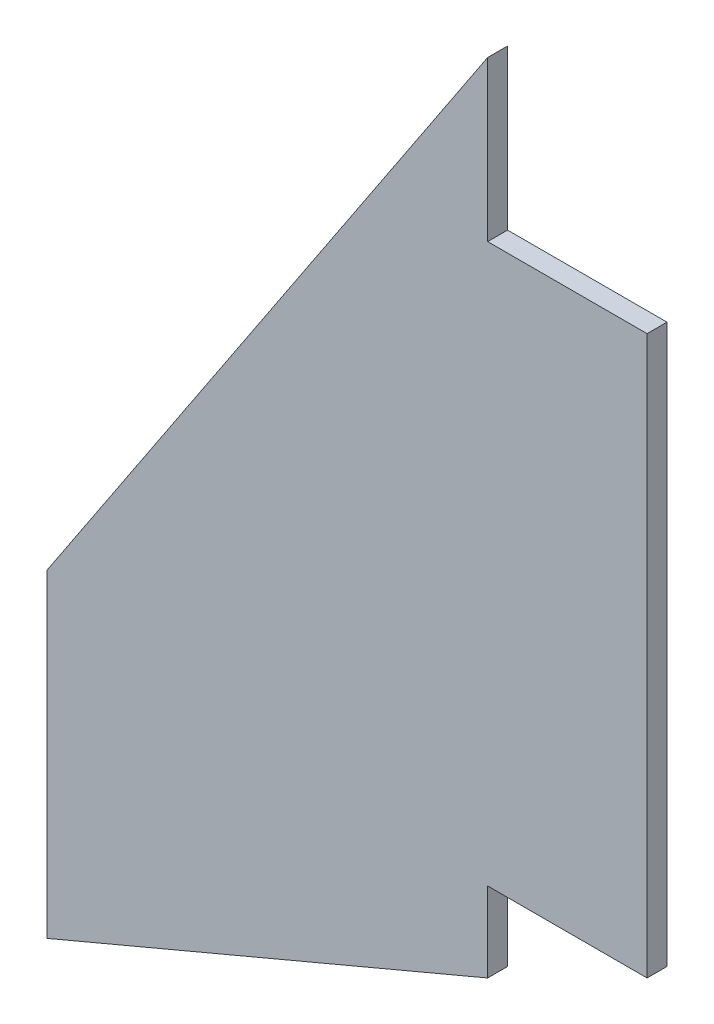
ISO-10303-21;
HEADER;
FILE_DESCRIPTION(('STEP AP214'),'2;1');
FILE_NAME('part.step','',(''),(''),'','','');
FILE_SCHEMA(('AUTOMOTIVE_DESIGN { 1 0 10303 214 1 1 1 1 }'));
ENDSEC;
DATA;
#1=APPLICATION_CONTEXT('core data for automotive mechanical design processes');
#2=APPLICATION_PROTOCOL_DEFINITION('international standard','automotive_design',2000,#1);
#3=PRODUCT_CONTEXT('',#1,'mechanical');
#4=PRODUCT('Part','Part','',(#3));
#5=PRODUCT_RELATED_PRODUCT_CATEGORY('part','',(#4));
#6=PRODUCT_DEFINITION_FORMATION('','',#4);
#7=PRODUCT_DEFINITION_CONTEXT('part definition',#1,'design');
#8=PRODUCT_DEFINITION('design','',#6,#7);
#9=PRODUCT_DEFINITION_SHAPE('','',#8);
#10=(LENGTH_UNIT() NAMED_UNIT(*) SI_UNIT(.MILLI.,.METRE.));
#11=(NAMED_UNIT(*) PLANE_ANGLE_UNIT() SI_UNIT($,.RADIAN.));
#12=(NAMED_UNIT(*) SI_UNIT($,.STERADIAN.) SOLID_ANGLE_UNIT());
#13=UNCERTAINTY_MEASURE_WITH_UNIT(LENGTH_MEASURE(1.E-05),#10,'distance_accuracy_value','');
#14=(GEOMETRIC_REPRESENTATION_CONTEXT(3) GLOBAL_UNCERTAINTY_ASSIGNED_CONTEXT((#13)) GLOBAL_UNIT_ASSIGNED_CONTEXT((#10,
#11,#12)) REPRESENTATION_CONTEXT('',''));
#15=CARTESIAN_POINT('',(0.,0.,0.));
#16=DIRECTION('',(0.,0.,1.));
#17=DIRECTION('',(1.,0.,0.));
#18=AXIS2_PLACEMENT_3D('',#15,#16,#17);
#19=CARTESIAN_POINT('',(-25.4,0.,1.5875));
#20=DIRECTION('',(0.,1.,0.));
#21=DIRECTION('',(0.,0.,1.));
#22=AXIS2_PLACEMENT_3D('',#19,#20,#21);
#23=PLANE('',#22);
#24=DIRECTION('',(1.,0.,0.));
#25=VECTOR('',#24,1.);
#26=CARTESIAN_POINT('',(-25.4,0.,-1.5875));
#27=LINE('',#26,#25);
#28=CARTESIAN_POINT('',(-25.4,0.,-1.5875));
#29=VERTEX_POINT('',#28);
#30=CARTESIAN_POINT('',(0.,0.,-1.5875));
#31=VERTEX_POINT('',#30);
#32=EDGE_CURVE('E144',#29,#31,#27,.T.);
#33=ORIENTED_EDGE('',*,*,#32,.T.);
#34=DIRECTION('',(0.,0.,-1.));
#35=VECTOR('',#34,1.);
#36=CARTESIAN_POINT('',(0.,0.,1.5875));
#37=LINE('',#36,#35);
#38=CARTESIAN_POINT('',(0.,0.,1.5875));
#39=VERTEX_POINT('',#38);
#40=EDGE_CURVE('E11',#39,#31,#37,.T.);
#41=ORIENTED_EDGE('',*,*,#40,.F.);
#42=DIRECTION('',(1.,0.,0.));
#43=VECTOR('',#42,1.);
#44=CARTESIAN_POINT('',(-25.4,0.,1.5875));
#45=LINE('',#44,#43);
#46=CARTESIAN_POINT('',(-25.4,0.,1.5875));
#47=VERTEX_POINT('',#46);
#48=EDGE_CURVE('E166',#47,#39,#45,.T.);
#49=ORIENTED_EDGE('',*,*,#48,.F.);
#50=DIRECTION('',(0.,0.,-1.));
#51=VECTOR('',#50,1.);
#52=CARTESIAN_POINT('',(-25.4,0.,1.5875));
#53=LINE('',#52,#51);
#54=EDGE_CURVE('E140',#47,#29,#53,.T.);
#55=ORIENTED_EDGE('',*,*,#54,.T.);
#56=EDGE_LOOP('',(#33,#41,#49,#55));
#57=FACE_BOUND('',#56,.T.);
#58=ADVANCED_FACE('F43',(#57),#23,.F.);
#59=CARTESIAN_POINT('',(0.,0.,1.5875));
#60=DIRECTION('',(-1.,0.,0.));
#61=DIRECTION('',(0.,0.,1.));
#62=AXIS2_PLACEMENT_3D('',#59,#60,#61);
#63=PLANE('',#62);
#64=DIRECTION('',(0.,1.,0.));
#65=VECTOR('',#64,1.);
#66=CARTESIAN_POINT('',(0.,0.,-1.5875));
#67=LINE('',#66,#65);
#68=CARTESIAN_POINT('',(0.,88.9,-1.5875));
#69=VERTEX_POINT('',#68);
#70=EDGE_CURVE('E148',#31,#69,#67,.T.);
#71=ORIENTED_EDGE('',*,*,#70,.T.);
#72=DIRECTION('',(0.,0.,-1.));
#73=VECTOR('',#72,1.);
#74=CARTESIAN_POINT('',(0.,88.9,1.5875));
#75=LINE('',#74,#73);
#76=CARTESIAN_POINT('',(0.,88.9,1.5875));
#77=VERTEX_POINT('',#76);
#78=EDGE_CURVE('E52',#77,#69,#75,.T.);
#79=ORIENTED_EDGE('',*,*,#78,.F.);
#80=DIRECTION('',(0.,1.,0.));
#81=VECTOR('',#80,1.);
#82=CARTESIAN_POINT('',(0.,0.,1.5875));
#83=LINE('',#82,#81);
#84=EDGE_CURVE('E103',#39,#77,#83,.T.);
#85=ORIENTED_EDGE('',*,*,#84,.F.);
#86=ORIENTED_EDGE('',*,*,#40,.T.);
#87=EDGE_LOOP('',(#71,#79,#85,#86));
#88=FACE_BOUND('',#87,.T.);
#89=ADVANCED_FACE('F212',(#88),#63,.F.);
#90=CARTESIAN_POINT('',(0.,88.9,1.5875));
#91=DIRECTION('',(0.,-1.,0.));
#92=DIRECTION('',(0.,0.,-1.));
#93=AXIS2_PLACEMENT_3D('',#90,#91,#92);
#94=PLANE('',#93);
#95=DIRECTION('',(-1.,0.,0.));
#96=VECTOR('',#95,1.);
#97=CARTESIAN_POINT('',(0.,88.9,-1.5875));
#98=LINE('',#97,#96);
#99=CARTESIAN_POINT('',(-25.4,88.9,-1.5875));
#100=VERTEX_POINT('',#99);
#101=EDGE_CURVE('E151',#69,#100,#98,.T.);
#102=ORIENTED_EDGE('',*,*,#101,.T.);
#103=DIRECTION('',(0.,0.,-1.));
#104=VECTOR('',#103,1.);
#105=CARTESIAN_POINT('',(-25.4,88.9,1.5875));
#106=LINE('',#105,#104);
#107=CARTESIAN_POINT('',(-25.4,88.9,1.5875));
#108=VERTEX_POINT('',#107);
#109=EDGE_CURVE('E177',#108,#100,#106,.T.);
#110=ORIENTED_EDGE('',*,*,#109,.F.);
#111=DIRECTION('',(-1.,0.,0.));
#112=VECTOR('',#111,1.);
#113=CARTESIAN_POINT('',(0.,88.9,1.5875));
#114=LINE('',#113,#112);
#115=EDGE_CURVE('E187',#77,#108,#114,.T.);
#116=ORIENTED_EDGE('',*,*,#115,.F.);
#117=ORIENTED_EDGE('',*,*,#78,.T.);
#118=EDGE_LOOP('',(#102,#110,#116,#117));
#119=FACE_BOUND('',#118,.T.);
#120=ADVANCED_FACE('F185',(#119),#94,.F.);
#121=CARTESIAN_POINT('',(-25.4,88.9,1.5875));
#122=DIRECTION('',(-1.,0.,0.));
#123=DIRECTION('',(0.,0.,1.));
#124=AXIS2_PLACEMENT_3D('',#121,#122,#123);
#125=PLANE('',#124);
#126=DIRECTION('',(0.,1.,0.));
#127=VECTOR('',#126,1.);
#128=CARTESIAN_POINT('',(-25.4,88.9,-1.5875));
#129=LINE('',#128,#127);
#130=CARTESIAN_POINT('',(-25.4,114.3,-1.5875));
#131=VERTEX_POINT('',#130);
#132=EDGE_CURVE('E154',#100,#131,#129,.T.);
#133=ORIENTED_EDGE('',*,*,#132,.T.);
#134=DIRECTION('',(0.,0.,-1.));
#135=VECTOR('',#134,1.);
#136=CARTESIAN_POINT('',(-25.4,114.3,1.5875));
#137=LINE('',#136,#135);
#138=CARTESIAN_POINT('',(-25.4,114.3,1.5875));
#139=VERTEX_POINT('',#138);
#140=EDGE_CURVE('E173',#139,#131,#137,.T.);
#141=ORIENTED_EDGE('',*,*,#140,.F.);
#142=DIRECTION('',(0.,1.,0.));
#143=VECTOR('',#142,1.);
#144=CARTESIAN_POINT('',(-25.4,88.9,1.5875));
#145=LINE('',#144,#143);
#146=EDGE_CURVE('E200',#108,#139,#145,.T.);
#147=ORIENTED_EDGE('',*,*,#146,.F.);
#148=ORIENTED_EDGE('',*,*,#109,.T.);
#149=EDGE_LOOP('',(#133,#141,#147,#148));
#150=FACE_BOUND('',#149,.T.);
#151=ADVANCED_FACE('F195',(#150),#125,.F.);
#152=CARTESIAN_POINT('',(-25.4,114.3,1.5875));
#153=DIRECTION('',(0.833333333333333,-0.552770798392566,0.));
#154=DIRECTION('',(0.552770798392566,0.833333333333334,0.));
#155=AXIS2_PLACEMENT_3D('',#152,#153,#154);
#156=PLANE('',#155);
#157=DIRECTION('',(-0.552770798392566,-0.833333333333333,0.));
#158=VECTOR('',#157,1.);
#159=CARTESIAN_POINT('',(-25.4,114.3,-1.5875));
#160=LINE('',#159,#158);
#161=CARTESIAN_POINT('',(-95.601891395856,8.46666666666661,-1.5875));
#162=VERTEX_POINT('',#161);
#163=EDGE_CURVE('E157',#131,#162,#160,.T.);
#164=ORIENTED_EDGE('',*,*,#163,.T.);
#165=DIRECTION('',(0.,0.,-1.));
#166=VECTOR('',#165,1.);
#167=CARTESIAN_POINT('',(-95.601891395856,8.46666666666661,1.5875));
#168=LINE('',#167,#166);
#169=CARTESIAN_POINT('',(-95.601891395856,8.46666666666661,1.5875));
#170=VERTEX_POINT('',#169);
#171=EDGE_CURVE('E133',#170,#162,#168,.T.);
#172=ORIENTED_EDGE('',*,*,#171,.F.);
#173=DIRECTION('',(-0.552770798392566,-0.833333333333333,0.));
#174=VECTOR('',#173,1.);
#175=CARTESIAN_POINT('',(-25.4,114.3,1.5875));
#176=LINE('',#175,#174);
#177=EDGE_CURVE('E122',#139,#170,#176,.T.);
#178=ORIENTED_EDGE('',*,*,#177,.F.);
#179=ORIENTED_EDGE('',*,*,#140,.T.);
#180=EDGE_LOOP('',(#164,#172,#178,#179));
#181=FACE_BOUND('',#180,.T.);
#182=ADVANCED_FACE('F198',(#181),#156,.F.);
#183=CARTESIAN_POINT('',(-95.601891395856,8.46666666666661,1.5875));
#184=DIRECTION('',(1.,0.,0.));
#185=DIRECTION('',(0.,0.,-1.));
#186=AXIS2_PLACEMENT_3D('',#183,#184,#185);
#187=PLANE('',#186);
#188=DIRECTION('',(0.,-1.,0.));
#189=VECTOR('',#188,1.);
#190=CARTESIAN_POINT('',(-95.601891395856,8.46666666666661,-1.5875));
#191=LINE('',#190,#189);
#192=CARTESIAN_POINT('',(-95.601891395856,-42.3333333333334,-1.5875));
#193=VERTEX_POINT('',#192);
#194=EDGE_CURVE('E131',#162,#193,#191,.T.);
#195=ORIENTED_EDGE('',*,*,#194,.T.);
#196=DIRECTION('',(0.,0.,-1.));
#197=VECTOR('',#196,1.);
#198=CARTESIAN_POINT('',(-95.601891395856,-42.3333333333334,1.5875));
#199=LINE('',#198,#197);
#200=CARTESIAN_POINT('',(-95.601891395856,-42.3333333333334,1.5875));
#201=VERTEX_POINT('',#200);
#202=EDGE_CURVE('E128',#201,#193,#199,.T.);
#203=ORIENTED_EDGE('',*,*,#202,.F.);
#204=DIRECTION('',(0.,-1.,0.));
#205=VECTOR('',#204,1.);
#206=CARTESIAN_POINT('',(-95.601891395856,8.46666666666661,1.5875));
#207=LINE('',#206,#205);
#208=EDGE_CURVE('E116',#170,#201,#207,.T.);
#209=ORIENTED_EDGE('',*,*,#208,.F.);
#210=ORIENTED_EDGE('',*,*,#171,.T.);
#211=EDGE_LOOP('',(#195,#203,#209,#210));
#212=FACE_BOUND('',#211,.T.);
#213=ADVANCED_FACE('F129',(#212),#187,.F.);
#214=CARTESIAN_POINT('',(-95.601891395856,-42.3333333333334,1.5875));
#215=DIRECTION('',(-0.38888888888889,0.921284663987611,0.));
#216=DIRECTION('',(-0.921284663987611,-0.38888888888889,0.));
#217=AXIS2_PLACEMENT_3D('',#214,#215,#216);
#218=PLANE('',#217);
#219=DIRECTION('',(0.921284663987611,0.38888888888889,0.));
#220=VECTOR('',#219,1.);
#221=CARTESIAN_POINT('',(-95.601891395856,-42.3333333333334,-1.5875));
#222=LINE('',#221,#220);
#223=CARTESIAN_POINT('',(-25.4,-12.7,-1.5875));
#224=VERTEX_POINT('',#223);
#225=EDGE_CURVE('E89',#193,#224,#222,.T.);
#226=ORIENTED_EDGE('',*,*,#225,.T.);
#227=DIRECTION('',(0.,0.,-1.));
#228=VECTOR('',#227,1.);
#229=CARTESIAN_POINT('',(-25.4,-12.7,1.5875));
#230=LINE('',#229,#228);
#231=CARTESIAN_POINT('',(-25.4,-12.7,1.5875));
#232=VERTEX_POINT('',#231);
#233=EDGE_CURVE('E134',#232,#224,#230,.T.);
#234=ORIENTED_EDGE('',*,*,#233,.F.);
#235=DIRECTION('',(0.921284663987611,0.38888888888889,0.));
#236=VECTOR('',#235,1.);
#237=CARTESIAN_POINT('',(-95.601891395856,-42.3333333333334,1.5875));
#238=LINE('',#237,#236);
#239=EDGE_CURVE('E120',#201,#232,#238,.T.);
#240=ORIENTED_EDGE('',*,*,#239,.F.);
#241=ORIENTED_EDGE('',*,*,#202,.T.);
#242=EDGE_LOOP('',(#226,#234,#240,#241));
#243=FACE_BOUND('',#242,.T.);
#244=ADVANCED_FACE('F136',(#243),#218,.F.);
#245=CARTESIAN_POINT('',(-25.4,-12.7,1.5875));
#246=DIRECTION('',(-1.,0.,0.));
#247=DIRECTION('',(0.,0.,1.));
#248=AXIS2_PLACEMENT_3D('',#245,#246,#247);
#249=PLANE('',#248);
#250=DIRECTION('',(0.,1.,0.));
#251=VECTOR('',#250,1.);
#252=CARTESIAN_POINT('',(-25.4,-12.7,-1.5875));
#253=LINE('',#252,#251);
#254=EDGE_CURVE('E95',#224,#29,#253,.T.);
#255=ORIENTED_EDGE('',*,*,#254,.T.);
#256=ORIENTED_EDGE('',*,*,#54,.F.);
#257=DIRECTION('',(0.,1.,0.));
#258=VECTOR('',#257,1.);
#259=CARTESIAN_POINT('',(-25.4,-12.7,1.5875));
#260=LINE('',#259,#258);
#261=EDGE_CURVE('E60',#232,#47,#260,.T.);
#262=ORIENTED_EDGE('',*,*,#261,.F.);
#263=ORIENTED_EDGE('',*,*,#233,.T.);
#264=EDGE_LOOP('',(#255,#256,#262,#263));
#265=FACE_BOUND('',#264,.T.);
#266=ADVANCED_FACE('F228',(#265),#249,.F.);
#267=CARTESIAN_POINT('',(0.,0.,1.5875));
#268=DIRECTION('',(0.,0.,1.));
#269=DIRECTION('',(1.,0.,0.));
#270=AXIS2_PLACEMENT_3D('',#267,#268,#269);
#271=PLANE('',#270);
#272=ORIENTED_EDGE('',*,*,#48,.T.);
#273=ORIENTED_EDGE('',*,*,#84,.T.);
#274=ORIENTED_EDGE('',*,*,#115,.T.);
#275=ORIENTED_EDGE('',*,*,#146,.T.);
#276=ORIENTED_EDGE('',*,*,#177,.T.);
#277=ORIENTED_EDGE('',*,*,#208,.T.);
#278=ORIENTED_EDGE('',*,*,#239,.T.);
#279=ORIENTED_EDGE('',*,*,#261,.T.);
#280=EDGE_LOOP('',(#272,#273,#274,#275,#276,#277,#278,#279));
#281=FACE_BOUND('',#280,.T.);
#282=ADVANCED_FACE('F118',(#281),#271,.T.);
#283=CARTESIAN_POINT('',(0.,0.,-1.5875));
#284=DIRECTION('',(0.,0.,1.));
#285=DIRECTION('',(1.,0.,0.));
#286=AXIS2_PLACEMENT_3D('',#283,#284,#285);
#287=PLANE('',#286);
#288=ORIENTED_EDGE('',*,*,#32,.F.);
#289=ORIENTED_EDGE('',*,*,#254,.F.);
#290=ORIENTED_EDGE('',*,*,#225,.F.);
#291=ORIENTED_EDGE('',*,*,#194,.F.);
#292=ORIENTED_EDGE('',*,*,#163,.F.);
#293=ORIENTED_EDGE('',*,*,#132,.F.);
#294=ORIENTED_EDGE('',*,*,#101,.F.);
#295=ORIENTED_EDGE('',*,*,#70,.F.);
#296=EDGE_LOOP('',(#288,#289,#290,#291,#292,#293,#294,#295));
#297=FACE_BOUND('',#296,.T.);
#298=ADVANCED_FACE('F191',(#297),#287,.F.);
#299=CLOSED_SHELL('',(#58,#89,#120,#151,#182,#213,#244,#266,#282,#298));
#300=MANIFOLD_SOLID_BREP('B2',#299);
#301=ADVANCED_BREP_SHAPE_REPRESENTATION('',(#18,#300),#14);
#302=SHAPE_DEFINITION_REPRESENTATION(#9,#301);
ENDSEC;
END-ISO-10303-21;
